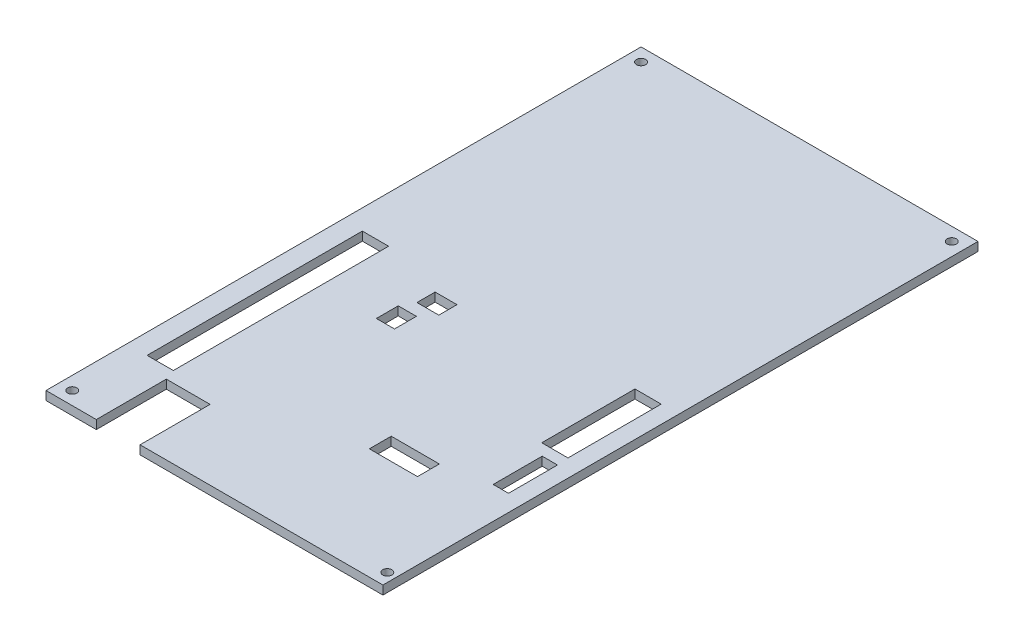
ISO-10303-21;
HEADER;
FILE_DESCRIPTION(('STEP AP214'),'2;1');
FILE_NAME('part.step','',(''),(''),'','','');
FILE_SCHEMA(('AUTOMOTIVE_DESIGN { 1 0 10303 214 1 1 1 1 }'));
ENDSEC;
DATA;
#1=APPLICATION_CONTEXT('core data for automotive mechanical design processes');
#2=APPLICATION_PROTOCOL_DEFINITION('international standard','automotive_design',2000,#1);
#3=PRODUCT_CONTEXT('',#1,'mechanical');
#4=PRODUCT('Part','Part','',(#3));
#5=PRODUCT_RELATED_PRODUCT_CATEGORY('part','',(#4));
#6=PRODUCT_DEFINITION_FORMATION('','',#4);
#7=PRODUCT_DEFINITION_CONTEXT('part definition',#1,'design');
#8=PRODUCT_DEFINITION('design','',#6,#7);
#9=PRODUCT_DEFINITION_SHAPE('','',#8);
#10=(LENGTH_UNIT() NAMED_UNIT(*) SI_UNIT(.MILLI.,.METRE.));
#11=(NAMED_UNIT(*) PLANE_ANGLE_UNIT() SI_UNIT($,.RADIAN.));
#12=(NAMED_UNIT(*) SI_UNIT($,.STERADIAN.) SOLID_ANGLE_UNIT());
#13=UNCERTAINTY_MEASURE_WITH_UNIT(LENGTH_MEASURE(1.E-05),#10,'distance_accuracy_value','');
#14=(GEOMETRIC_REPRESENTATION_CONTEXT(3) GLOBAL_UNCERTAINTY_ASSIGNED_CONTEXT((#13)) GLOBAL_UNIT_ASSIGNED_CONTEXT((#10,
#11,#12)) REPRESENTATION_CONTEXT('',''));
#15=CARTESIAN_POINT('',(0.,0.,0.));
#16=DIRECTION('',(0.,0.,1.));
#17=DIRECTION('',(1.,0.,0.));
#18=AXIS2_PLACEMENT_3D('',#15,#16,#17);
#19=CARTESIAN_POINT('',(0.,2.,72.05));
#20=DIRECTION('',(0.,0.,-1.));
#21=DIRECTION('',(-1.,0.,0.));
#22=AXIS2_PLACEMENT_3D('',#19,#20,#21);
#23=PLANE('',#22);
#24=DIRECTION('',(1.,0.,0.));
#25=VECTOR('',#24,1.);
#26=CARTESIAN_POINT('',(0.,0.,72.05));
#27=LINE('',#26,#25);
#28=CARTESIAN_POINT('',(24.98,0.,72.05));
#29=VERTEX_POINT('',#28);
#30=CARTESIAN_POINT('',(29.98,0.,72.05));
#31=VERTEX_POINT('',#30);
#32=EDGE_CURVE('E564',#29,#31,#27,.T.);
#33=ORIENTED_EDGE('',*,*,#32,.T.);
#34=DIRECTION('',(0.,-1.,0.));
#35=VECTOR('',#34,1.);
#36=CARTESIAN_POINT('',(29.98,2.,72.05));
#37=LINE('',#36,#35);
#38=CARTESIAN_POINT('',(29.98,2.,72.05));
#39=VERTEX_POINT('',#38);
#40=EDGE_CURVE('E12',#39,#31,#37,.T.);
#41=ORIENTED_EDGE('',*,*,#40,.F.);
#42=DIRECTION('',(1.,0.,0.));
#43=VECTOR('',#42,1.);
#44=CARTESIAN_POINT('',(0.,2.,72.05));
#45=LINE('',#44,#43);
#46=CARTESIAN_POINT('',(24.98,2.,72.05));
#47=VERTEX_POINT('',#46);
#48=EDGE_CURVE('E266',#47,#39,#45,.T.);
#49=ORIENTED_EDGE('',*,*,#48,.F.);
#50=DIRECTION('',(0.,-1.,0.));
#51=VECTOR('',#50,1.);
#52=CARTESIAN_POINT('',(24.98,2.,72.05));
#53=LINE('',#52,#51);
#54=EDGE_CURVE('E62',#47,#29,#53,.T.);
#55=ORIENTED_EDGE('',*,*,#54,.T.);
#56=EDGE_LOOP('',(#33,#41,#49,#55));
#57=FACE_BOUND('',#56,.T.);
#58=ADVANCED_FACE('F42',(#57),#23,.F.);
#59=CARTESIAN_POINT('',(29.98,2.,0.));
#60=DIRECTION('',(1.,0.,0.));
#61=DIRECTION('',(0.,0.,-1.));
#62=AXIS2_PLACEMENT_3D('',#59,#60,#61);
#63=PLANE('',#62);
#64=DIRECTION('',(0.,0.,1.));
#65=VECTOR('',#64,1.);
#66=CARTESIAN_POINT('',(29.98,0.,0.));
#67=LINE('',#66,#65);
#68=CARTESIAN_POINT('',(29.98,0.,76.2));
#69=VERTEX_POINT('',#68);
#70=EDGE_CURVE('E273',#31,#69,#67,.T.);
#71=ORIENTED_EDGE('',*,*,#70,.T.);
#72=DIRECTION('',(0.,-1.,0.));
#73=VECTOR('',#72,1.);
#74=CARTESIAN_POINT('',(29.98,2.,76.2));
#75=LINE('',#74,#73);
#76=CARTESIAN_POINT('',(29.98,2.,76.2));
#77=VERTEX_POINT('',#76);
#78=EDGE_CURVE('E53',#77,#69,#75,.T.);
#79=ORIENTED_EDGE('',*,*,#78,.F.);
#80=DIRECTION('',(0.,0.,1.));
#81=VECTOR('',#80,1.);
#82=CARTESIAN_POINT('',(29.98,2.,0.));
#83=LINE('',#82,#81);
#84=EDGE_CURVE('E260',#39,#77,#83,.T.);
#85=ORIENTED_EDGE('',*,*,#84,.F.);
#86=ORIENTED_EDGE('',*,*,#40,.T.);
#87=EDGE_LOOP('',(#71,#79,#85,#86));
#88=FACE_BOUND('',#87,.T.);
#89=ADVANCED_FACE('F272',(#88),#63,.F.);
#90=CARTESIAN_POINT('',(0.,2.,76.2));
#91=DIRECTION('',(0.,0.,-1.));
#92=DIRECTION('',(-1.,0.,0.));
#93=AXIS2_PLACEMENT_3D('',#90,#91,#92);
#94=PLANE('',#93);
#95=DIRECTION('',(1.,0.,0.));
#96=VECTOR('',#95,1.);
#97=CARTESIAN_POINT('',(0.,0.,76.2));
#98=LINE('',#97,#96);
#99=CARTESIAN_POINT('',(24.98,0.,76.2));
#100=VERTEX_POINT('',#99);
#101=EDGE_CURVE('E559',#100,#69,#98,.T.);
#102=ORIENTED_EDGE('',*,*,#101,.F.);
#103=DIRECTION('',(0.,-1.,0.));
#104=VECTOR('',#103,1.);
#105=CARTESIAN_POINT('',(24.98,2.,76.2));
#106=LINE('',#105,#104);
#107=CARTESIAN_POINT('',(24.98,2.,76.2));
#108=VERTEX_POINT('',#107);
#109=EDGE_CURVE('E160',#108,#100,#106,.T.);
#110=ORIENTED_EDGE('',*,*,#109,.F.);
#111=DIRECTION('',(1.,0.,0.));
#112=VECTOR('',#111,1.);
#113=CARTESIAN_POINT('',(0.,2.,76.2));
#114=LINE('',#113,#112);
#115=EDGE_CURVE('E265',#108,#77,#114,.T.);
#116=ORIENTED_EDGE('',*,*,#115,.T.);
#117=ORIENTED_EDGE('',*,*,#78,.T.);
#118=EDGE_LOOP('',(#102,#110,#116,#117));
#119=FACE_BOUND('',#118,.T.);
#120=ADVANCED_FACE('F278',(#119),#94,.T.);
#121=CARTESIAN_POINT('',(0.,2.,79.));
#122=DIRECTION('',(0.,0.,-1.));
#123=DIRECTION('',(-1.,0.,0.));
#124=AXIS2_PLACEMENT_3D('',#121,#122,#123);
#125=PLANE('',#124);
#126=DIRECTION('',(1.,0.,0.));
#127=VECTOR('',#126,1.);
#128=CARTESIAN_POINT('',(0.,0.,79.));
#129=LINE('',#128,#127);
#130=CARTESIAN_POINT('',(23.5,0.,79.));
#131=VERTEX_POINT('',#130);
#132=CARTESIAN_POINT('',(27.65,0.,79.));
#133=VERTEX_POINT('',#132);
#134=EDGE_CURVE('E579',#131,#133,#129,.T.);
#135=ORIENTED_EDGE('',*,*,#134,.T.);
#136=DIRECTION('',(0.,-1.,0.));
#137=VECTOR('',#136,1.);
#138=CARTESIAN_POINT('',(27.65,2.,79.));
#139=LINE('',#138,#137);
#140=CARTESIAN_POINT('',(27.65,2.,79.));
#141=VERTEX_POINT('',#140);
#142=EDGE_CURVE('E538',#141,#133,#139,.T.);
#143=ORIENTED_EDGE('',*,*,#142,.F.);
#144=DIRECTION('',(1.,0.,0.));
#145=VECTOR('',#144,1.);
#146=CARTESIAN_POINT('',(0.,2.,79.));
#147=LINE('',#146,#145);
#148=CARTESIAN_POINT('',(23.5,2.,79.));
#149=VERTEX_POINT('',#148);
#150=EDGE_CURVE('E314',#149,#141,#147,.T.);
#151=ORIENTED_EDGE('',*,*,#150,.F.);
#152=DIRECTION('',(0.,-1.,0.));
#153=VECTOR('',#152,1.);
#154=CARTESIAN_POINT('',(23.5,2.,79.));
#155=LINE('',#154,#153);
#156=EDGE_CURVE('E529',#149,#131,#155,.T.);
#157=ORIENTED_EDGE('',*,*,#156,.T.);
#158=EDGE_LOOP('',(#135,#143,#151,#157));
#159=FACE_BOUND('',#158,.T.);
#160=ADVANCED_FACE('F726',(#159),#125,.F.);
#161=CARTESIAN_POINT('',(27.65,2.,0.));
#162=DIRECTION('',(1.,0.,0.));
#163=DIRECTION('',(0.,0.,-1.));
#164=AXIS2_PLACEMENT_3D('',#161,#162,#163);
#165=PLANE('',#164);
#166=DIRECTION('',(0.,0.,1.));
#167=VECTOR('',#166,1.);
#168=CARTESIAN_POINT('',(27.65,0.,0.));
#169=LINE('',#168,#167);
#170=CARTESIAN_POINT('',(27.65,0.,84.));
#171=VERTEX_POINT('',#170);
#172=EDGE_CURVE('E575',#133,#171,#169,.T.);
#173=ORIENTED_EDGE('',*,*,#172,.T.);
#174=DIRECTION('',(0.,-1.,0.));
#175=VECTOR('',#174,1.);
#176=CARTESIAN_POINT('',(27.65,2.,84.));
#177=LINE('',#176,#175);
#178=CARTESIAN_POINT('',(27.65,2.,84.));
#179=VERTEX_POINT('',#178);
#180=EDGE_CURVE('E542',#179,#171,#177,.T.);
#181=ORIENTED_EDGE('',*,*,#180,.F.);
#182=DIRECTION('',(0.,0.,1.));
#183=VECTOR('',#182,1.);
#184=CARTESIAN_POINT('',(27.65,2.,0.));
#185=LINE('',#184,#183);
#186=EDGE_CURVE('E306',#141,#179,#185,.T.);
#187=ORIENTED_EDGE('',*,*,#186,.F.);
#188=ORIENTED_EDGE('',*,*,#142,.T.);
#189=EDGE_LOOP('',(#173,#181,#187,#188));
#190=FACE_BOUND('',#189,.T.);
#191=ADVANCED_FACE('F722',(#190),#165,.F.);
#192=CARTESIAN_POINT('',(0.,2.,84.));
#193=DIRECTION('',(0.,0.,-1.));
#194=DIRECTION('',(-1.,0.,0.));
#195=AXIS2_PLACEMENT_3D('',#192,#193,#194);
#196=PLANE('',#195);
#197=DIRECTION('',(1.,0.,0.));
#198=VECTOR('',#197,1.);
#199=CARTESIAN_POINT('',(0.,0.,84.));
#200=LINE('',#199,#198);
#201=CARTESIAN_POINT('',(23.5,0.,84.));
#202=VERTEX_POINT('',#201);
#203=EDGE_CURVE('E571',#202,#171,#200,.T.);
#204=ORIENTED_EDGE('',*,*,#203,.F.);
#205=DIRECTION('',(0.,-1.,0.));
#206=VECTOR('',#205,1.);
#207=CARTESIAN_POINT('',(23.5,2.,84.));
#208=LINE('',#207,#206);
#209=CARTESIAN_POINT('',(23.5,2.,84.));
#210=VERTEX_POINT('',#209);
#211=EDGE_CURVE('E545',#210,#202,#208,.T.);
#212=ORIENTED_EDGE('',*,*,#211,.F.);
#213=DIRECTION('',(1.,0.,0.));
#214=VECTOR('',#213,1.);
#215=CARTESIAN_POINT('',(0.,2.,84.));
#216=LINE('',#215,#214);
#217=EDGE_CURVE('E301',#210,#179,#216,.T.);
#218=ORIENTED_EDGE('',*,*,#217,.T.);
#219=ORIENTED_EDGE('',*,*,#180,.T.);
#220=EDGE_LOOP('',(#204,#212,#218,#219));
#221=FACE_BOUND('',#220,.T.);
#222=ADVANCED_FACE('F718',(#221),#196,.T.);
#223=CARTESIAN_POINT('',(0.,2.,105.6));
#224=DIRECTION('',(0.,0.,-1.));
#225=DIRECTION('',(-1.,0.,0.));
#226=AXIS2_PLACEMENT_3D('',#223,#224,#225);
#227=PLANE('',#226);
#228=DIRECTION('',(1.,0.,0.));
#229=VECTOR('',#228,1.);
#230=CARTESIAN_POINT('',(0.,0.,105.6));
#231=LINE('',#230,#229);
#232=CARTESIAN_POINT('',(48.5,0.,105.6));
#233=VERTEX_POINT('',#232);
#234=CARTESIAN_POINT('',(59.5,0.,105.6));
#235=VERTEX_POINT('',#234);
#236=EDGE_CURVE('E595',#233,#235,#231,.T.);
#237=ORIENTED_EDGE('',*,*,#236,.T.);
#238=DIRECTION('',(0.,-1.,0.));
#239=VECTOR('',#238,1.);
#240=CARTESIAN_POINT('',(59.5,2.,105.6));
#241=LINE('',#240,#239);
#242=CARTESIAN_POINT('',(59.5,2.,105.6));
#243=VERTEX_POINT('',#242);
#244=EDGE_CURVE('E525',#243,#235,#241,.T.);
#245=ORIENTED_EDGE('',*,*,#244,.F.);
#246=DIRECTION('',(1.,0.,0.));
#247=VECTOR('',#246,1.);
#248=CARTESIAN_POINT('',(0.,2.,105.6));
#249=LINE('',#248,#247);
#250=CARTESIAN_POINT('',(48.5,2.,105.6));
#251=VERTEX_POINT('',#250);
#252=EDGE_CURVE('E336',#251,#243,#249,.T.);
#253=ORIENTED_EDGE('',*,*,#252,.F.);
#254=DIRECTION('',(0.,-1.,0.));
#255=VECTOR('',#254,1.);
#256=CARTESIAN_POINT('',(48.5,2.,105.6));
#257=LINE('',#256,#255);
#258=EDGE_CURVE('E516',#251,#233,#257,.T.);
#259=ORIENTED_EDGE('',*,*,#258,.T.);
#260=EDGE_LOOP('',(#237,#245,#253,#259));
#261=FACE_BOUND('',#260,.T.);
#262=ADVANCED_FACE('F721',(#261),#227,.F.);
#263=CARTESIAN_POINT('',(59.5,2.,0.));
#264=DIRECTION('',(1.,0.,0.));
#265=DIRECTION('',(0.,0.,-1.));
#266=AXIS2_PLACEMENT_3D('',#263,#264,#265);
#267=PLANE('',#266);
#268=DIRECTION('',(0.,0.,1.));
#269=VECTOR('',#268,1.);
#270=CARTESIAN_POINT('',(59.5,0.,0.));
#271=LINE('',#270,#269);
#272=CARTESIAN_POINT('',(59.5,0.,110.6));
#273=VERTEX_POINT('',#272);
#274=EDGE_CURVE('E591',#235,#273,#271,.T.);
#275=ORIENTED_EDGE('',*,*,#274,.T.);
#276=DIRECTION('',(0.,-1.,0.));
#277=VECTOR('',#276,1.);
#278=CARTESIAN_POINT('',(59.5,2.,110.6));
#279=LINE('',#278,#277);
#280=CARTESIAN_POINT('',(59.5,2.,110.6));
#281=VERTEX_POINT('',#280);
#282=EDGE_CURVE('E530',#281,#273,#279,.T.);
#283=ORIENTED_EDGE('',*,*,#282,.F.);
#284=DIRECTION('',(0.,0.,1.));
#285=VECTOR('',#284,1.);
#286=CARTESIAN_POINT('',(59.5,2.,0.));
#287=LINE('',#286,#285);
#288=EDGE_CURVE('E328',#243,#281,#287,.T.);
#289=ORIENTED_EDGE('',*,*,#288,.F.);
#290=ORIENTED_EDGE('',*,*,#244,.T.);
#291=EDGE_LOOP('',(#275,#283,#289,#290));
#292=FACE_BOUND('',#291,.T.);
#293=ADVANCED_FACE('F739',(#292),#267,.F.);
#294=CARTESIAN_POINT('',(0.,2.,110.6));
#295=DIRECTION('',(0.,0.,-1.));
#296=DIRECTION('',(-1.,0.,0.));
#297=AXIS2_PLACEMENT_3D('',#294,#295,#296);
#298=PLANE('',#297);
#299=DIRECTION('',(1.,0.,0.));
#300=VECTOR('',#299,1.);
#301=CARTESIAN_POINT('',(0.,0.,110.6));
#302=LINE('',#301,#300);
#303=CARTESIAN_POINT('',(48.5,0.,110.6));
#304=VERTEX_POINT('',#303);
#305=EDGE_CURVE('E587',#304,#273,#302,.T.);
#306=ORIENTED_EDGE('',*,*,#305,.F.);
#307=DIRECTION('',(0.,-1.,0.));
#308=VECTOR('',#307,1.);
#309=CARTESIAN_POINT('',(48.5,2.,110.6));
#310=LINE('',#309,#308);
#311=CARTESIAN_POINT('',(48.5,2.,110.6));
#312=VERTEX_POINT('',#311);
#313=EDGE_CURVE('E533',#312,#304,#310,.T.);
#314=ORIENTED_EDGE('',*,*,#313,.F.);
#315=DIRECTION('',(1.,0.,0.));
#316=VECTOR('',#315,1.);
#317=CARTESIAN_POINT('',(0.,2.,110.6));
#318=LINE('',#317,#316);
#319=EDGE_CURVE('E323',#312,#281,#318,.T.);
#320=ORIENTED_EDGE('',*,*,#319,.T.);
#321=ORIENTED_EDGE('',*,*,#282,.T.);
#322=EDGE_LOOP('',(#306,#314,#320,#321));
#323=FACE_BOUND('',#322,.T.);
#324=ADVANCED_FACE('F735',(#323),#298,.T.);
#325=CARTESIAN_POINT('',(0.,2.,92.3));
#326=DIRECTION('',(0.,0.,-1.));
#327=DIRECTION('',(-1.,0.,0.));
#328=AXIS2_PLACEMENT_3D('',#325,#326,#327);
#329=PLANE('',#328);
#330=DIRECTION('',(1.,0.,0.));
#331=VECTOR('',#330,1.);
#332=CARTESIAN_POINT('',(0.,0.,92.3));
#333=LINE('',#332,#331);
#334=CARTESIAN_POINT('',(69.7,0.,92.3));
#335=VERTEX_POINT('',#334);
#336=CARTESIAN_POINT('',(73.2,0.,92.3));
#337=VERTEX_POINT('',#336);
#338=EDGE_CURVE('E611',#335,#337,#333,.T.);
#339=ORIENTED_EDGE('',*,*,#338,.T.);
#340=DIRECTION('',(0.,-1.,0.));
#341=VECTOR('',#340,1.);
#342=CARTESIAN_POINT('',(73.2,2.,92.3));
#343=LINE('',#342,#341);
#344=CARTESIAN_POINT('',(73.2,2.,92.3));
#345=VERTEX_POINT('',#344);
#346=EDGE_CURVE('E512',#345,#337,#343,.T.);
#347=ORIENTED_EDGE('',*,*,#346,.F.);
#348=DIRECTION('',(1.,0.,0.));
#349=VECTOR('',#348,1.);
#350=CARTESIAN_POINT('',(0.,2.,92.3));
#351=LINE('',#350,#349);
#352=CARTESIAN_POINT('',(69.7,2.,92.3));
#353=VERTEX_POINT('',#352);
#354=EDGE_CURVE('E358',#353,#345,#351,.T.);
#355=ORIENTED_EDGE('',*,*,#354,.F.);
#356=DIRECTION('',(0.,-1.,0.));
#357=VECTOR('',#356,1.);
#358=CARTESIAN_POINT('',(69.7,2.,92.3));
#359=LINE('',#358,#357);
#360=EDGE_CURVE('E503',#353,#335,#359,.T.);
#361=ORIENTED_EDGE('',*,*,#360,.T.);
#362=EDGE_LOOP('',(#339,#347,#355,#361));
#363=FACE_BOUND('',#362,.T.);
#364=ADVANCED_FACE('F738',(#363),#329,.F.);
#365=CARTESIAN_POINT('',(73.2,2.,0.));
#366=DIRECTION('',(1.,0.,0.));
#367=DIRECTION('',(0.,0.,-1.));
#368=AXIS2_PLACEMENT_3D('',#365,#366,#367);
#369=PLANE('',#368);
#370=DIRECTION('',(0.,0.,1.));
#371=VECTOR('',#370,1.);
#372=CARTESIAN_POINT('',(73.2,0.,0.));
#373=LINE('',#372,#371);
#374=CARTESIAN_POINT('',(73.2,0.,103.5));
#375=VERTEX_POINT('',#374);
#376=EDGE_CURVE('E607',#337,#375,#373,.T.);
#377=ORIENTED_EDGE('',*,*,#376,.T.);
#378=DIRECTION('',(0.,-1.,0.));
#379=VECTOR('',#378,1.);
#380=CARTESIAN_POINT('',(73.2,2.,103.5));
#381=LINE('',#380,#379);
#382=CARTESIAN_POINT('',(73.2,2.,103.5));
#383=VERTEX_POINT('',#382);
#384=EDGE_CURVE('E517',#383,#375,#381,.T.);
#385=ORIENTED_EDGE('',*,*,#384,.F.);
#386=DIRECTION('',(0.,0.,1.));
#387=VECTOR('',#386,1.);
#388=CARTESIAN_POINT('',(73.2,2.,0.));
#389=LINE('',#388,#387);
#390=EDGE_CURVE('E350',#345,#383,#389,.T.);
#391=ORIENTED_EDGE('',*,*,#390,.F.);
#392=ORIENTED_EDGE('',*,*,#346,.T.);
#393=EDGE_LOOP('',(#377,#385,#391,#392));
#394=FACE_BOUND('',#393,.T.);
#395=ADVANCED_FACE('F755',(#394),#369,.F.);
#396=CARTESIAN_POINT('',(0.,2.,103.5));
#397=DIRECTION('',(0.,0.,-1.));
#398=DIRECTION('',(-1.,0.,0.));
#399=AXIS2_PLACEMENT_3D('',#396,#397,#398);
#400=PLANE('',#399);
#401=DIRECTION('',(1.,0.,0.));
#402=VECTOR('',#401,1.);
#403=CARTESIAN_POINT('',(0.,0.,103.5));
#404=LINE('',#403,#402);
#405=CARTESIAN_POINT('',(69.7,0.,103.5));
#406=VERTEX_POINT('',#405);
#407=EDGE_CURVE('E603',#406,#375,#404,.T.);
#408=ORIENTED_EDGE('',*,*,#407,.F.);
#409=DIRECTION('',(0.,-1.,0.));
#410=VECTOR('',#409,1.);
#411=CARTESIAN_POINT('',(69.7,2.,103.5));
#412=LINE('',#411,#410);
#413=CARTESIAN_POINT('',(69.7,2.,103.5));
#414=VERTEX_POINT('',#413);
#415=EDGE_CURVE('E520',#414,#406,#412,.T.);
#416=ORIENTED_EDGE('',*,*,#415,.F.);
#417=DIRECTION('',(1.,0.,0.));
#418=VECTOR('',#417,1.);
#419=CARTESIAN_POINT('',(0.,2.,103.5));
#420=LINE('',#419,#418);
#421=EDGE_CURVE('E345',#414,#383,#420,.T.);
#422=ORIENTED_EDGE('',*,*,#421,.T.);
#423=ORIENTED_EDGE('',*,*,#384,.T.);
#424=EDGE_LOOP('',(#408,#416,#422,#423));
#425=FACE_BOUND('',#424,.T.);
#426=ADVANCED_FACE('F751',(#425),#400,.T.);
#427=CARTESIAN_POINT('',(0.,2.,68.3));
#428=DIRECTION('',(0.,0.,-1.));
#429=DIRECTION('',(-1.,0.,0.));
#430=AXIS2_PLACEMENT_3D('',#427,#428,#429);
#431=PLANE('',#430);
#432=DIRECTION('',(1.,0.,0.));
#433=VECTOR('',#432,1.);
#434=CARTESIAN_POINT('',(0.,0.,68.3));
#435=LINE('',#434,#433);
#436=CARTESIAN_POINT('',(4.60000000000001,0.,68.3));
#437=VERTEX_POINT('',#436);
#438=CARTESIAN_POINT('',(10.6,0.,68.3));
#439=VERTEX_POINT('',#438);
#440=EDGE_CURVE('E627',#437,#439,#435,.T.);
#441=ORIENTED_EDGE('',*,*,#440,.T.);
#442=DIRECTION('',(0.,-1.,0.));
#443=VECTOR('',#442,1.);
#444=CARTESIAN_POINT('',(10.6,2.,68.3));
#445=LINE('',#444,#443);
#446=CARTESIAN_POINT('',(10.6,2.,68.3));
#447=VERTEX_POINT('',#446);
#448=EDGE_CURVE('E499',#447,#439,#445,.T.);
#449=ORIENTED_EDGE('',*,*,#448,.F.);
#450=DIRECTION('',(1.,0.,0.));
#451=VECTOR('',#450,1.);
#452=CARTESIAN_POINT('',(0.,2.,68.3));
#453=LINE('',#452,#451);
#454=CARTESIAN_POINT('',(4.60000000000001,2.,68.3));
#455=VERTEX_POINT('',#454);
#456=EDGE_CURVE('E380',#455,#447,#453,.T.);
#457=ORIENTED_EDGE('',*,*,#456,.F.);
#458=DIRECTION('',(0.,-1.,0.));
#459=VECTOR('',#458,1.);
#460=CARTESIAN_POINT('',(4.60000000000001,2.,68.3));
#461=LINE('',#460,#459);
#462=EDGE_CURVE('E489',#455,#437,#461,.T.);
#463=ORIENTED_EDGE('',*,*,#462,.T.);
#464=EDGE_LOOP('',(#441,#449,#457,#463));
#465=FACE_BOUND('',#464,.T.);
#466=ADVANCED_FACE('F754',(#465),#431,.F.);
#467=CARTESIAN_POINT('',(10.6,2.,0.));
#468=DIRECTION('',(1.,0.,0.));
#469=DIRECTION('',(0.,0.,-1.));
#470=AXIS2_PLACEMENT_3D('',#467,#468,#469);
#471=PLANE('',#470);
#472=DIRECTION('',(0.,0.,1.));
#473=VECTOR('',#472,1.);
#474=CARTESIAN_POINT('',(10.6,0.,0.));
#475=LINE('',#474,#473);
#476=CARTESIAN_POINT('',(10.6,0.,117.5));
#477=VERTEX_POINT('',#476);
#478=EDGE_CURVE('E623',#439,#477,#475,.T.);
#479=ORIENTED_EDGE('',*,*,#478,.T.);
#480=DIRECTION('',(0.,-1.,0.));
#481=VECTOR('',#480,1.);
#482=CARTESIAN_POINT('',(10.6,2.,117.5));
#483=LINE('',#482,#481);
#484=CARTESIAN_POINT('',(10.6,2.,117.5));
#485=VERTEX_POINT('',#484);
#486=EDGE_CURVE('E504',#485,#477,#483,.T.);
#487=ORIENTED_EDGE('',*,*,#486,.F.);
#488=DIRECTION('',(0.,0.,1.));
#489=VECTOR('',#488,1.);
#490=CARTESIAN_POINT('',(10.6,2.,0.));
#491=LINE('',#490,#489);
#492=EDGE_CURVE('E372',#447,#485,#491,.T.);
#493=ORIENTED_EDGE('',*,*,#492,.F.);
#494=ORIENTED_EDGE('',*,*,#448,.T.);
#495=EDGE_LOOP('',(#479,#487,#493,#494));
#496=FACE_BOUND('',#495,.T.);
#497=ADVANCED_FACE('F771',(#496),#471,.F.);
#498=CARTESIAN_POINT('',(0.,2.,117.5));
#499=DIRECTION('',(0.,0.,-1.));
#500=DIRECTION('',(-1.,0.,0.));
#501=AXIS2_PLACEMENT_3D('',#498,#499,#500);
#502=PLANE('',#501);
#503=DIRECTION('',(1.,0.,0.));
#504=VECTOR('',#503,1.);
#505=CARTESIAN_POINT('',(0.,0.,117.5));
#506=LINE('',#505,#504);
#507=CARTESIAN_POINT('',(4.60000000000001,0.,117.5));
#508=VERTEX_POINT('',#507);
#509=EDGE_CURVE('E619',#508,#477,#506,.T.);
#510=ORIENTED_EDGE('',*,*,#509,.F.);
#511=DIRECTION('',(0.,-1.,0.));
#512=VECTOR('',#511,1.);
#513=CARTESIAN_POINT('',(4.60000000000001,2.,117.5));
#514=LINE('',#513,#512);
#515=CARTESIAN_POINT('',(4.60000000000001,2.,117.5));
#516=VERTEX_POINT('',#515);
#517=EDGE_CURVE('E507',#516,#508,#514,.T.);
#518=ORIENTED_EDGE('',*,*,#517,.F.);
#519=DIRECTION('',(1.,0.,0.));
#520=VECTOR('',#519,1.);
#521=CARTESIAN_POINT('',(0.,2.,117.5));
#522=LINE('',#521,#520);
#523=EDGE_CURVE('E367',#516,#485,#522,.T.);
#524=ORIENTED_EDGE('',*,*,#523,.T.);
#525=ORIENTED_EDGE('',*,*,#486,.T.);
#526=EDGE_LOOP('',(#510,#518,#524,#525));
#527=FACE_BOUND('',#526,.T.);
#528=ADVANCED_FACE('F767',(#527),#502,.T.);
#529=CARTESIAN_POINT('',(67.,2.,0.));
#530=DIRECTION('',(1.,0.,0.));
#531=DIRECTION('',(0.,0.,-1.));
#532=AXIS2_PLACEMENT_3D('',#529,#530,#531);
#533=PLANE('',#532);
#534=DIRECTION('',(0.,0.,1.));
#535=VECTOR('',#534,1.);
#536=CARTESIAN_POINT('',(67.,0.,0.));
#537=LINE('',#536,#535);
#538=CARTESIAN_POINT('',(67.,0.,68.4));
#539=VERTEX_POINT('',#538);
#540=CARTESIAN_POINT('',(67.,0.,89.7));
#541=VERTEX_POINT('',#540);
#542=EDGE_CURVE('E643',#539,#541,#537,.T.);
#543=ORIENTED_EDGE('',*,*,#542,.F.);
#544=DIRECTION('',(0.,-1.,0.));
#545=VECTOR('',#544,1.);
#546=CARTESIAN_POINT('',(67.,2.,68.4));
#547=LINE('',#546,#545);
#548=CARTESIAN_POINT('',(67.,2.,68.4));
#549=VERTEX_POINT('',#548);
#550=EDGE_CURVE('E486',#549,#539,#547,.T.);
#551=ORIENTED_EDGE('',*,*,#550,.F.);
#552=DIRECTION('',(0.,0.,1.));
#553=VECTOR('',#552,1.);
#554=CARTESIAN_POINT('',(67.,2.,0.));
#555=LINE('',#554,#553);
#556=CARTESIAN_POINT('',(67.,2.,89.7));
#557=VERTEX_POINT('',#556);
#558=EDGE_CURVE('E401',#549,#557,#555,.T.);
#559=ORIENTED_EDGE('',*,*,#558,.T.);
#560=DIRECTION('',(0.,-1.,0.));
#561=VECTOR('',#560,1.);
#562=CARTESIAN_POINT('',(67.,2.,89.7));
#563=LINE('',#562,#561);
#564=EDGE_CURVE('E466',#557,#541,#563,.T.);
#565=ORIENTED_EDGE('',*,*,#564,.T.);
#566=EDGE_LOOP('',(#543,#551,#559,#565));
#567=FACE_BOUND('',#566,.T.);
#568=ADVANCED_FACE('F770',(#567),#533,.T.);
#569=CARTESIAN_POINT('',(1.58206781009085E-13,2.,68.4000000000002));
#570=DIRECTION('',(0.,0.,1.));
#571=DIRECTION('',(1.,0.,0.));
#572=AXIS2_PLACEMENT_3D('',#569,#570,#571);
#573=PLANE('',#572);
#574=DIRECTION('',(-1.,0.,0.));
#575=VECTOR('',#574,1.);
#576=CARTESIAN_POINT('',(1.58206781009085E-13,0.,68.4000000000002));
#577=LINE('',#576,#575);
#578=CARTESIAN_POINT('',(73.,0.,68.4));
#579=VERTEX_POINT('',#578);
#580=EDGE_CURVE('E639',#579,#539,#577,.T.);
#581=ORIENTED_EDGE('',*,*,#580,.F.);
#582=DIRECTION('',(0.,-1.,0.));
#583=VECTOR('',#582,1.);
#584=CARTESIAN_POINT('',(73.,2.,68.4));
#585=LINE('',#584,#583);
#586=CARTESIAN_POINT('',(73.,2.,68.4));
#587=VERTEX_POINT('',#586);
#588=EDGE_CURVE('E490',#587,#579,#585,.T.);
#589=ORIENTED_EDGE('',*,*,#588,.F.);
#590=DIRECTION('',(-1.,0.,0.));
#591=VECTOR('',#590,1.);
#592=CARTESIAN_POINT('',(1.58206781009085E-13,2.,68.4000000000002));
#593=LINE('',#592,#591);
#594=EDGE_CURVE('E393',#587,#549,#593,.T.);
#595=ORIENTED_EDGE('',*,*,#594,.T.);
#596=ORIENTED_EDGE('',*,*,#550,.T.);
#597=EDGE_LOOP('',(#581,#589,#595,#596));
#598=FACE_BOUND('',#597,.T.);
#599=ADVANCED_FACE('F787',(#598),#573,.T.);
#600=CARTESIAN_POINT('',(73.,2.,0.));
#601=DIRECTION('',(1.,0.,0.));
#602=DIRECTION('',(0.,0.,-1.));
#603=AXIS2_PLACEMENT_3D('',#600,#601,#602);
#604=PLANE('',#603);
#605=DIRECTION('',(0.,0.,1.));
#606=VECTOR('',#605,1.);
#607=CARTESIAN_POINT('',(73.,0.,0.));
#608=LINE('',#607,#606);
#609=CARTESIAN_POINT('',(73.,0.,89.7));
#610=VERTEX_POINT('',#609);
#611=EDGE_CURVE('E635',#579,#610,#608,.T.);
#612=ORIENTED_EDGE('',*,*,#611,.T.);
#613=DIRECTION('',(0.,-1.,0.));
#614=VECTOR('',#613,1.);
#615=CARTESIAN_POINT('',(73.,2.,89.7));
#616=LINE('',#615,#614);
#617=CARTESIAN_POINT('',(73.,2.,89.7));
#618=VERTEX_POINT('',#617);
#619=EDGE_CURVE('E493',#618,#610,#616,.T.);
#620=ORIENTED_EDGE('',*,*,#619,.F.);
#621=DIRECTION('',(0.,0.,1.));
#622=VECTOR('',#621,1.);
#623=CARTESIAN_POINT('',(73.,2.,0.));
#624=LINE('',#623,#622);
#625=EDGE_CURVE('E388',#587,#618,#624,.T.);
#626=ORIENTED_EDGE('',*,*,#625,.F.);
#627=ORIENTED_EDGE('',*,*,#588,.T.);
#628=EDGE_LOOP('',(#612,#620,#626,#627));
#629=FACE_BOUND('',#628,.T.);
#630=ADVANCED_FACE('F783',(#629),#604,.F.);
#631=CARTESIAN_POINT('',(21.5,2.,0.));
#632=DIRECTION('',(-1.,0.,0.));
#633=DIRECTION('',(0.,0.,1.));
#634=AXIS2_PLACEMENT_3D('',#631,#632,#633);
#635=PLANE('',#634);
#636=DIRECTION('',(0.,0.,-1.));
#637=VECTOR('',#636,1.);
#638=CARTESIAN_POINT('',(21.5,0.,0.));
#639=LINE('',#638,#637);
#640=CARTESIAN_POINT('',(21.5,0.,136.));
#641=VERTEX_POINT('',#640);
#642=CARTESIAN_POINT('',(21.5,0.,120.));
#643=VERTEX_POINT('',#642);
#644=EDGE_CURVE('E669',#641,#643,#639,.T.);
#645=ORIENTED_EDGE('',*,*,#644,.F.);
#646=DIRECTION('',(0.,-1.,0.));
#647=VECTOR('',#646,1.);
#648=CARTESIAN_POINT('',(21.5,2.,136.));
#649=LINE('',#648,#647);
#650=CARTESIAN_POINT('',(21.5,2.,136.));
#651=VERTEX_POINT('',#650);
#652=EDGE_CURVE('E46',#651,#641,#649,.T.);
#653=ORIENTED_EDGE('',*,*,#652,.F.);
#654=DIRECTION('',(0.,0.,-1.));
#655=VECTOR('',#654,1.);
#656=CARTESIAN_POINT('',(21.5,2.,0.));
#657=LINE('',#656,#655);
#658=CARTESIAN_POINT('',(21.5,2.,120.));
#659=VERTEX_POINT('',#658);
#660=EDGE_CURVE('E428',#651,#659,#657,.T.);
#661=ORIENTED_EDGE('',*,*,#660,.T.);
#662=DIRECTION('',(0.,-1.,0.));
#663=VECTOR('',#662,1.);
#664=CARTESIAN_POINT('',(21.5,2.,120.));
#665=LINE('',#664,#663);
#666=EDGE_CURVE('E283',#659,#643,#665,.T.);
#667=ORIENTED_EDGE('',*,*,#666,.T.);
#668=EDGE_LOOP('',(#645,#653,#661,#667));
#669=FACE_BOUND('',#668,.T.);
#670=ADVANCED_FACE('F786',(#669),#635,.T.);
#671=CARTESIAN_POINT('',(0.,2.,136.));
#672=DIRECTION('',(0.,0.,-1.));
#673=DIRECTION('',(-1.,0.,0.));
#674=AXIS2_PLACEMENT_3D('',#671,#672,#673);
#675=PLANE('',#674);
#676=DIRECTION('',(1.,0.,0.));
#677=VECTOR('',#676,1.);
#678=CARTESIAN_POINT('',(0.,0.,136.));
#679=LINE('',#678,#677);
#680=CARTESIAN_POINT('',(77.,0.,136.));
#681=VERTEX_POINT('',#680);
#682=EDGE_CURVE('E461',#641,#681,#679,.T.);
#683=ORIENTED_EDGE('',*,*,#682,.T.);
#684=DIRECTION('',(0.,-1.,0.));
#685=VECTOR('',#684,1.);
#686=CARTESIAN_POINT('',(77.,2.,136.));
#687=LINE('',#686,#685);
#688=CARTESIAN_POINT('',(77.,2.,136.));
#689=VERTEX_POINT('',#688);
#690=EDGE_CURVE('E452',#689,#681,#687,.T.);
#691=ORIENTED_EDGE('',*,*,#690,.F.);
#692=DIRECTION('',(1.,0.,0.));
#693=VECTOR('',#692,1.);
#694=CARTESIAN_POINT('',(0.,2.,136.));
#695=LINE('',#694,#693);
#696=EDGE_CURVE('E422',#651,#689,#695,.T.);
#697=ORIENTED_EDGE('',*,*,#696,.F.);
#698=ORIENTED_EDGE('',*,*,#652,.T.);
#699=EDGE_LOOP('',(#683,#691,#697,#698));
#700=FACE_BOUND('',#699,.T.);
#701=ADVANCED_FACE('F459',(#700),#675,.F.);
#702=CARTESIAN_POINT('',(77.,2.,0.));
#703=DIRECTION('',(1.,0.,0.));
#704=DIRECTION('',(0.,0.,-1.));
#705=AXIS2_PLACEMENT_3D('',#702,#703,#704);
#706=PLANE('',#705);
#707=DIRECTION('',(0.,0.,1.));
#708=VECTOR('',#707,1.);
#709=CARTESIAN_POINT('',(77.,0.,0.));
#710=LINE('',#709,#708);
#711=CARTESIAN_POINT('',(77.,0.,0.));
#712=VERTEX_POINT('',#711);
#713=EDGE_CURVE('E664',#712,#681,#710,.T.);
#714=ORIENTED_EDGE('',*,*,#713,.F.);
#715=DIRECTION('',(0.,-1.,0.));
#716=VECTOR('',#715,1.);
#717=CARTESIAN_POINT('',(77.,2.,0.));
#718=LINE('',#717,#716);
#719=CARTESIAN_POINT('',(77.,2.,0.));
#720=VERTEX_POINT('',#719);
#721=EDGE_CURVE('E454',#720,#712,#718,.T.);
#722=ORIENTED_EDGE('',*,*,#721,.F.);
#723=DIRECTION('',(0.,0.,1.));
#724=VECTOR('',#723,1.);
#725=CARTESIAN_POINT('',(77.,2.,0.));
#726=LINE('',#725,#724);
#727=EDGE_CURVE('E427',#720,#689,#726,.T.);
#728=ORIENTED_EDGE('',*,*,#727,.T.);
#729=ORIENTED_EDGE('',*,*,#690,.T.);
#730=EDGE_LOOP('',(#714,#722,#728,#729));
#731=FACE_BOUND('',#730,.T.);
#732=ADVANCED_FACE('F450',(#731),#706,.T.);
#733=CARTESIAN_POINT('',(0.,2.,0.));
#734=DIRECTION('',(0.,0.,-1.));
#735=DIRECTION('',(-1.,0.,0.));
#736=AXIS2_PLACEMENT_3D('',#733,#734,#735);
#737=PLANE('',#736);
#738=DIRECTION('',(1.,0.,0.));
#739=VECTOR('',#738,1.);
#740=CARTESIAN_POINT('',(0.,0.,0.));
#741=LINE('',#740,#739);
#742=CARTESIAN_POINT('',(0.,0.,0.));
#743=VERTEX_POINT('',#742);
#744=EDGE_CURVE('E660',#743,#712,#741,.T.);
#745=ORIENTED_EDGE('',*,*,#744,.F.);
#746=DIRECTION('',(0.,-1.,0.));
#747=VECTOR('',#746,1.);
#748=CARTESIAN_POINT('',(0.,2.,0.));
#749=LINE('',#748,#747);
#750=CARTESIAN_POINT('',(0.,2.,0.));
#751=VERTEX_POINT('',#750);
#752=EDGE_CURVE('E467',#751,#743,#749,.T.);
#753=ORIENTED_EDGE('',*,*,#752,.F.);
#754=DIRECTION('',(1.,0.,0.));
#755=VECTOR('',#754,1.);
#756=CARTESIAN_POINT('',(0.,2.,0.));
#757=LINE('',#756,#755);
#758=EDGE_CURVE('E437',#751,#720,#757,.T.);
#759=ORIENTED_EDGE('',*,*,#758,.T.);
#760=ORIENTED_EDGE('',*,*,#721,.T.);
#761=EDGE_LOOP('',(#745,#753,#759,#760));
#762=FACE_BOUND('',#761,.T.);
#763=ADVANCED_FACE('F809',(#762),#737,.T.);
#764=CARTESIAN_POINT('',(0.,2.,0.));
#765=DIRECTION('',(1.,0.,0.));
#766=DIRECTION('',(0.,0.,-1.));
#767=AXIS2_PLACEMENT_3D('',#764,#765,#766);
#768=PLANE('',#767);
#769=DIRECTION('',(0.,0.,1.));
#770=VECTOR('',#769,1.);
#771=CARTESIAN_POINT('',(0.,0.,0.));
#772=LINE('',#771,#770);
#773=CARTESIAN_POINT('',(0.,0.,136.));
#774=VERTEX_POINT('',#773);
#775=EDGE_CURVE('E656',#743,#774,#772,.T.);
#776=ORIENTED_EDGE('',*,*,#775,.T.);
#777=DIRECTION('',(0.,-1.,0.));
#778=VECTOR('',#777,1.);
#779=CARTESIAN_POINT('',(0.,2.,136.));
#780=LINE('',#779,#778);
#781=CARTESIAN_POINT('',(0.,2.,136.));
#782=VERTEX_POINT('',#781);
#783=EDGE_CURVE('E472',#782,#774,#780,.T.);
#784=ORIENTED_EDGE('',*,*,#783,.F.);
#785=DIRECTION('',(0.,0.,1.));
#786=VECTOR('',#785,1.);
#787=CARTESIAN_POINT('',(0.,2.,0.));
#788=LINE('',#787,#786);
#789=EDGE_CURVE('E415',#751,#782,#788,.T.);
#790=ORIENTED_EDGE('',*,*,#789,.F.);
#791=ORIENTED_EDGE('',*,*,#752,.T.);
#792=EDGE_LOOP('',(#776,#784,#790,#791));
#793=FACE_BOUND('',#792,.T.);
#794=ADVANCED_FACE('F805',(#793),#768,.F.);
#795=CARTESIAN_POINT('',(11.5,0.,136.));
#796=VERTEX_POINT('',#795);
#797=EDGE_CURVE('E655',#774,#796,#679,.T.);
#798=ORIENTED_EDGE('',*,*,#797,.T.);
#799=DIRECTION('',(0.,-1.,0.));
#800=VECTOR('',#799,1.);
#801=CARTESIAN_POINT('',(11.5,2.,136.));
#802=LINE('',#801,#800);
#803=CARTESIAN_POINT('',(11.5,2.,136.));
#804=VERTEX_POINT('',#803);
#805=EDGE_CURVE('E476',#804,#796,#802,.T.);
#806=ORIENTED_EDGE('',*,*,#805,.F.);
#807=EDGE_CURVE('E414',#782,#804,#695,.T.);
#808=ORIENTED_EDGE('',*,*,#807,.F.);
#809=ORIENTED_EDGE('',*,*,#783,.T.);
#810=EDGE_LOOP('',(#798,#806,#808,#809));
#811=FACE_BOUND('',#810,.T.);
#812=ADVANCED_FACE('F801',(#811),#675,.F.);
#813=CARTESIAN_POINT('',(11.5,2.,0.));
#814=DIRECTION('',(-1.,0.,0.));
#815=DIRECTION('',(0.,0.,1.));
#816=AXIS2_PLACEMENT_3D('',#813,#814,#815);
#817=PLANE('',#816);
#818=DIRECTION('',(0.,0.,-1.));
#819=VECTOR('',#818,1.);
#820=CARTESIAN_POINT('',(11.5,0.,0.));
#821=LINE('',#820,#819);
#822=CARTESIAN_POINT('',(11.5,0.,120.));
#823=VERTEX_POINT('',#822);
#824=EDGE_CURVE('E651',#796,#823,#821,.T.);
#825=ORIENTED_EDGE('',*,*,#824,.T.);
#826=DIRECTION('',(0.,-1.,0.));
#827=VECTOR('',#826,1.);
#828=CARTESIAN_POINT('',(11.5,2.,120.));
#829=LINE('',#828,#827);
#830=CARTESIAN_POINT('',(11.5,2.,120.));
#831=VERTEX_POINT('',#830);
#832=EDGE_CURVE('E480',#831,#823,#829,.T.);
#833=ORIENTED_EDGE('',*,*,#832,.F.);
#834=DIRECTION('',(0.,0.,-1.));
#835=VECTOR('',#834,1.);
#836=CARTESIAN_POINT('',(11.5,2.,0.));
#837=LINE('',#836,#835);
#838=EDGE_CURVE('E409',#804,#831,#837,.T.);
#839=ORIENTED_EDGE('',*,*,#838,.F.);
#840=ORIENTED_EDGE('',*,*,#805,.T.);
#841=EDGE_LOOP('',(#825,#833,#839,#840));
#842=FACE_BOUND('',#841,.T.);
#843=ADVANCED_FACE('F716',(#842),#817,.F.);
#844=CARTESIAN_POINT('',(23.5,2.,0.));
#845=DIRECTION('',(1.,0.,0.));
#846=DIRECTION('',(0.,0.,-1.));
#847=AXIS2_PLACEMENT_3D('',#844,#845,#846);
#848=PLANE('',#847);
#849=DIRECTION('',(0.,0.,1.));
#850=VECTOR('',#849,1.);
#851=CARTESIAN_POINT('',(23.5,0.,0.));
#852=LINE('',#851,#850);
#853=EDGE_CURVE('E567',#131,#202,#852,.T.);
#854=ORIENTED_EDGE('',*,*,#853,.F.);
#855=ORIENTED_EDGE('',*,*,#156,.F.);
#856=DIRECTION('',(0.,0.,1.));
#857=VECTOR('',#856,1.);
#858=CARTESIAN_POINT('',(23.5,2.,0.));
#859=LINE('',#858,#857);
#860=EDGE_CURVE('E296',#149,#210,#859,.T.);
#861=ORIENTED_EDGE('',*,*,#860,.T.);
#862=ORIENTED_EDGE('',*,*,#211,.T.);
#863=EDGE_LOOP('',(#854,#855,#861,#862));
#864=FACE_BOUND('',#863,.T.);
#865=ADVANCED_FACE('F712',(#864),#848,.T.);
#866=CARTESIAN_POINT('',(48.5,2.,0.));
#867=DIRECTION('',(1.,0.,0.));
#868=DIRECTION('',(0.,0.,-1.));
#869=AXIS2_PLACEMENT_3D('',#866,#867,#868);
#870=PLANE('',#869);
#871=DIRECTION('',(0.,0.,1.));
#872=VECTOR('',#871,1.);
#873=CARTESIAN_POINT('',(48.5,0.,0.));
#874=LINE('',#873,#872);
#875=EDGE_CURVE('E583',#233,#304,#874,.T.);
#876=ORIENTED_EDGE('',*,*,#875,.F.);
#877=ORIENTED_EDGE('',*,*,#258,.F.);
#878=DIRECTION('',(0.,0.,1.));
#879=VECTOR('',#878,1.);
#880=CARTESIAN_POINT('',(48.5,2.,0.));
#881=LINE('',#880,#879);
#882=EDGE_CURVE('E318',#251,#312,#881,.T.);
#883=ORIENTED_EDGE('',*,*,#882,.T.);
#884=ORIENTED_EDGE('',*,*,#313,.T.);
#885=EDGE_LOOP('',(#876,#877,#883,#884));
#886=FACE_BOUND('',#885,.T.);
#887=ADVANCED_FACE('F715',(#886),#870,.T.);
#888=CARTESIAN_POINT('',(69.7,2.,0.));
#889=DIRECTION('',(1.,0.,0.));
#890=DIRECTION('',(0.,0.,-1.));
#891=AXIS2_PLACEMENT_3D('',#888,#889,#890);
#892=PLANE('',#891);
#893=DIRECTION('',(0.,0.,1.));
#894=VECTOR('',#893,1.);
#895=CARTESIAN_POINT('',(69.7,0.,0.));
#896=LINE('',#895,#894);
#897=EDGE_CURVE('E599',#335,#406,#896,.T.);
#898=ORIENTED_EDGE('',*,*,#897,.F.);
#899=ORIENTED_EDGE('',*,*,#360,.F.);
#900=DIRECTION('',(0.,0.,1.));
#901=VECTOR('',#900,1.);
#902=CARTESIAN_POINT('',(69.7,2.,0.));
#903=LINE('',#902,#901);
#904=EDGE_CURVE('E340',#353,#414,#903,.T.);
#905=ORIENTED_EDGE('',*,*,#904,.T.);
#906=ORIENTED_EDGE('',*,*,#415,.T.);
#907=EDGE_LOOP('',(#898,#899,#905,#906));
#908=FACE_BOUND('',#907,.T.);
#909=ADVANCED_FACE('F733',(#908),#892,.T.);
#910=CARTESIAN_POINT('',(4.6,2.,0.));
#911=DIRECTION('',(1.,0.,0.));
#912=DIRECTION('',(0.,0.,-1.));
#913=AXIS2_PLACEMENT_3D('',#910,#911,#912);
#914=PLANE('',#913);
#915=DIRECTION('',(0.,0.,1.));
#916=VECTOR('',#915,1.);
#917=CARTESIAN_POINT('',(4.6,0.,0.));
#918=LINE('',#917,#916);
#919=EDGE_CURVE('E615',#437,#508,#918,.T.);
#920=ORIENTED_EDGE('',*,*,#919,.F.);
#921=ORIENTED_EDGE('',*,*,#462,.F.);
#922=DIRECTION('',(0.,0.,1.));
#923=VECTOR('',#922,1.);
#924=CARTESIAN_POINT('',(4.6,2.,0.));
#925=LINE('',#924,#923);
#926=EDGE_CURVE('E362',#455,#516,#925,.T.);
#927=ORIENTED_EDGE('',*,*,#926,.T.);
#928=ORIENTED_EDGE('',*,*,#517,.T.);
#929=EDGE_LOOP('',(#920,#921,#927,#928));
#930=FACE_BOUND('',#929,.T.);
#931=ADVANCED_FACE('F749',(#930),#914,.T.);
#932=CARTESIAN_POINT('',(0.,2.,89.7));
#933=DIRECTION('',(0.,0.,1.));
#934=DIRECTION('',(1.,0.,0.));
#935=AXIS2_PLACEMENT_3D('',#932,#933,#934);
#936=PLANE('',#935);
#937=DIRECTION('',(-1.,0.,0.));
#938=VECTOR('',#937,1.);
#939=CARTESIAN_POINT('',(0.,0.,89.7));
#940=LINE('',#939,#938);
#941=EDGE_CURVE('E631',#610,#541,#940,.T.);
#942=ORIENTED_EDGE('',*,*,#941,.T.);
#943=ORIENTED_EDGE('',*,*,#564,.F.);
#944=DIRECTION('',(-1.,0.,0.));
#945=VECTOR('',#944,1.);
#946=CARTESIAN_POINT('',(0.,2.,89.7));
#947=LINE('',#946,#945);
#948=EDGE_CURVE('E384',#618,#557,#947,.T.);
#949=ORIENTED_EDGE('',*,*,#948,.F.);
#950=ORIENTED_EDGE('',*,*,#619,.T.);
#951=EDGE_LOOP('',(#942,#943,#949,#950));
#952=FACE_BOUND('',#951,.T.);
#953=ADVANCED_FACE('F765',(#952),#936,.F.);
#954=CARTESIAN_POINT('',(0.,2.,120.));
#955=DIRECTION('',(0.,0.,-1.));
#956=DIRECTION('',(-1.,0.,0.));
#957=AXIS2_PLACEMENT_3D('',#954,#955,#956);
#958=PLANE('',#957);
#959=DIRECTION('',(1.,0.,0.));
#960=VECTOR('',#959,1.);
#961=CARTESIAN_POINT('',(0.,0.,120.));
#962=LINE('',#961,#960);
#963=EDGE_CURVE('E647',#823,#643,#962,.T.);
#964=ORIENTED_EDGE('',*,*,#963,.T.);
#965=ORIENTED_EDGE('',*,*,#666,.F.);
#966=DIRECTION('',(1.,0.,0.));
#967=VECTOR('',#966,1.);
#968=CARTESIAN_POINT('',(0.,2.,120.));
#969=LINE('',#968,#967);
#970=EDGE_CURVE('E405',#831,#659,#969,.T.);
#971=ORIENTED_EDGE('',*,*,#970,.F.);
#972=ORIENTED_EDGE('',*,*,#832,.T.);
#973=EDGE_LOOP('',(#964,#965,#971,#972));
#974=FACE_BOUND('',#973,.T.);
#975=ADVANCED_FACE('F781',(#974),#958,.F.);
#976=CARTESIAN_POINT('',(3.,2.,3.));
#977=DIRECTION('',(0.,-1.,0.));
#978=DIRECTION('',(0.,0.,-1.));
#979=AXIS2_PLACEMENT_3D('',#976,#977,#978);
#980=CYLINDRICAL_SURFACE('',#979,1.05);
#981=CARTESIAN_POINT('',(3.,2.,3.));
#982=DIRECTION('',(0.,1.,0.));
#983=DIRECTION('',(0.,0.,1.));
#984=AXIS2_PLACEMENT_3D('',#981,#982,#983);
#985=CIRCLE('',#984,1.05);
#986=CARTESIAN_POINT('',(3.,2.,4.05));
#987=VERTEX_POINT('',#986);
#988=EDGE_CURVE('E872',#987,#987,#985,.T.);
#989=ORIENTED_EDGE('',*,*,#988,.T.);
#990=EDGE_LOOP('',(#989));
#991=FACE_BOUND('',#990,.T.);
#992=CARTESIAN_POINT('',(3.,0.,3.));
#993=DIRECTION('',(0.,1.,0.));
#994=DIRECTION('',(0.,0.,1.));
#995=AXIS2_PLACEMENT_3D('',#992,#993,#994);
#996=CIRCLE('',#995,1.05);
#997=CARTESIAN_POINT('',(3.,0.,4.05));
#998=VERTEX_POINT('',#997);
#999=EDGE_CURVE('E673',#998,#998,#996,.T.);
#1000=ORIENTED_EDGE('',*,*,#999,.F.);
#1001=EDGE_LOOP('',(#1000));
#1002=FACE_BOUND('',#1001,.T.);
#1003=ADVANCED_FACE('F797',(#991,#1002),#980,.F.);
#1004=CARTESIAN_POINT('',(74.,2.,3.));
#1005=DIRECTION('',(0.,-1.,0.));
#1006=DIRECTION('',(0.,0.,-1.));
#1007=AXIS2_PLACEMENT_3D('',#1004,#1005,#1006);
#1008=CYLINDRICAL_SURFACE('',#1007,1.04999999999999);
#1009=CARTESIAN_POINT('',(74.,2.,3.));
#1010=DIRECTION('',(0.,1.,0.));
#1011=DIRECTION('',(0.,0.,1.));
#1012=AXIS2_PLACEMENT_3D('',#1009,#1010,#1011);
#1013=CIRCLE('',#1012,1.04999999999999);
#1014=CARTESIAN_POINT('',(74.,2.,4.04999999999999));
#1015=VERTEX_POINT('',#1014);
#1016=EDGE_CURVE('E827',#1015,#1015,#1013,.T.);
#1017=ORIENTED_EDGE('',*,*,#1016,.T.);
#1018=EDGE_LOOP('',(#1017));
#1019=FACE_BOUND('',#1018,.T.);
#1020=CARTESIAN_POINT('',(74.,0.,3.));
#1021=DIRECTION('',(0.,1.,0.));
#1022=DIRECTION('',(0.,0.,1.));
#1023=AXIS2_PLACEMENT_3D('',#1020,#1021,#1022);
#1024=CIRCLE('',#1023,1.04999999999999);
#1025=CARTESIAN_POINT('',(74.,0.,4.04999999999999));
#1026=VERTEX_POINT('',#1025);
#1027=EDGE_CURVE('E677',#1026,#1026,#1024,.T.);
#1028=ORIENTED_EDGE('',*,*,#1027,.F.);
#1029=EDGE_LOOP('',(#1028));
#1030=FACE_BOUND('',#1029,.T.);
#1031=ADVANCED_FACE('F701',(#1019,#1030),#1008,.F.);
#1032=CARTESIAN_POINT('',(3.00000000000002,2.,133.));
#1033=DIRECTION('',(0.,-1.,0.));
#1034=DIRECTION('',(0.,0.,-1.));
#1035=AXIS2_PLACEMENT_3D('',#1032,#1033,#1034);
#1036=CYLINDRICAL_SURFACE('',#1035,1.05);
#1037=CARTESIAN_POINT('',(3.00000000000002,2.,133.));
#1038=DIRECTION('',(0.,1.,0.));
#1039=DIRECTION('',(0.,0.,1.));
#1040=AXIS2_PLACEMENT_3D('',#1037,#1038,#1039);
#1041=CIRCLE('',#1040,1.05);
#1042=CARTESIAN_POINT('',(3.00000000000002,2.,134.05));
#1043=VERTEX_POINT('',#1042);
#1044=EDGE_CURVE('E877',#1043,#1043,#1041,.T.);
#1045=ORIENTED_EDGE('',*,*,#1044,.T.);
#1046=EDGE_LOOP('',(#1045));
#1047=FACE_BOUND('',#1046,.T.);
#1048=CARTESIAN_POINT('',(3.00000000000002,0.,133.));
#1049=DIRECTION('',(0.,1.,0.));
#1050=DIRECTION('',(0.,0.,1.));
#1051=AXIS2_PLACEMENT_3D('',#1048,#1049,#1050);
#1052=CIRCLE('',#1051,1.05);
#1053=CARTESIAN_POINT('',(3.00000000000002,0.,134.05));
#1054=VERTEX_POINT('',#1053);
#1055=EDGE_CURVE('E681',#1054,#1054,#1052,.T.);
#1056=ORIENTED_EDGE('',*,*,#1055,.F.);
#1057=EDGE_LOOP('',(#1056));
#1058=FACE_BOUND('',#1057,.T.);
#1059=ADVANCED_FACE('F694',(#1047,#1058),#1036,.F.);
#1060=CARTESIAN_POINT('',(75.,2.,133.));
#1061=DIRECTION('',(0.,-1.,0.));
#1062=DIRECTION('',(0.,0.,-1.));
#1063=AXIS2_PLACEMENT_3D('',#1060,#1061,#1062);
#1064=CYLINDRICAL_SURFACE('',#1063,1.04999999999999);
#1065=CARTESIAN_POINT('',(75.,2.,133.));
#1066=DIRECTION('',(0.,1.,0.));
#1067=DIRECTION('',(0.,0.,1.));
#1068=AXIS2_PLACEMENT_3D('',#1065,#1066,#1067);
#1069=CIRCLE('',#1068,1.04999999999999);
#1070=CARTESIAN_POINT('',(75.,2.,134.05));
#1071=VERTEX_POINT('',#1070);
#1072=EDGE_CURVE('E558',#1071,#1071,#1069,.T.);
#1073=ORIENTED_EDGE('',*,*,#1072,.T.);
#1074=EDGE_LOOP('',(#1073));
#1075=FACE_BOUND('',#1074,.T.);
#1076=CARTESIAN_POINT('',(75.,0.,133.));
#1077=DIRECTION('',(0.,1.,0.));
#1078=DIRECTION('',(0.,0.,1.));
#1079=AXIS2_PLACEMENT_3D('',#1076,#1077,#1078);
#1080=CIRCLE('',#1079,1.04999999999999);
#1081=CARTESIAN_POINT('',(75.,0.,134.05));
#1082=VERTEX_POINT('',#1081);
#1083=EDGE_CURVE('E684',#1082,#1082,#1080,.T.);
#1084=ORIENTED_EDGE('',*,*,#1083,.F.);
#1085=EDGE_LOOP('',(#1084));
#1086=FACE_BOUND('',#1085,.T.);
#1087=ADVANCED_FACE('F44',(#1075,#1086),#1064,.F.);
#1088=CARTESIAN_POINT('',(24.98,2.,0.));
#1089=DIRECTION('',(1.,0.,0.));
#1090=DIRECTION('',(0.,0.,-1.));
#1091=AXIS2_PLACEMENT_3D('',#1088,#1089,#1090);
#1092=PLANE('',#1091);
#1093=DIRECTION('',(0.,0.,1.));
#1094=VECTOR('',#1093,1.);
#1095=CARTESIAN_POINT('',(24.98,0.,0.));
#1096=LINE('',#1095,#1094);
#1097=EDGE_CURVE('E554',#29,#100,#1096,.T.);
#1098=ORIENTED_EDGE('',*,*,#1097,.F.);
#1099=ORIENTED_EDGE('',*,*,#54,.F.);
#1100=DIRECTION('',(0.,0.,1.));
#1101=VECTOR('',#1100,1.);
#1102=CARTESIAN_POINT('',(24.98,2.,0.));
#1103=LINE('',#1102,#1101);
#1104=EDGE_CURVE('E280',#47,#108,#1103,.T.);
#1105=ORIENTED_EDGE('',*,*,#1104,.T.);
#1106=ORIENTED_EDGE('',*,*,#109,.T.);
#1107=EDGE_LOOP('',(#1098,#1099,#1105,#1106));
#1108=FACE_BOUND('',#1107,.T.);
#1109=ADVANCED_FACE('F693',(#1108),#1092,.T.);
#1110=CARTESIAN_POINT('',(0.,2.,0.));
#1111=DIRECTION('',(0.,1.,0.));
#1112=DIRECTION('',(0.,0.,1.));
#1113=AXIS2_PLACEMENT_3D('',#1110,#1111,#1112);
#1114=PLANE('',#1113);
#1115=ORIENTED_EDGE('',*,*,#1072,.F.);
#1116=EDGE_LOOP('',(#1115));
#1117=FACE_BOUND('',#1116,.T.);
#1118=ORIENTED_EDGE('',*,*,#1044,.F.);
#1119=EDGE_LOOP('',(#1118));
#1120=FACE_BOUND('',#1119,.T.);
#1121=ORIENTED_EDGE('',*,*,#1016,.F.);
#1122=EDGE_LOOP('',(#1121));
#1123=FACE_BOUND('',#1122,.T.);
#1124=ORIENTED_EDGE('',*,*,#988,.F.);
#1125=EDGE_LOOP('',(#1124));
#1126=FACE_BOUND('',#1125,.T.);
#1127=ORIENTED_EDGE('',*,*,#660,.F.);
#1128=ORIENTED_EDGE('',*,*,#696,.T.);
#1129=ORIENTED_EDGE('',*,*,#727,.F.);
#1130=ORIENTED_EDGE('',*,*,#758,.F.);
#1131=ORIENTED_EDGE('',*,*,#789,.T.);
#1132=ORIENTED_EDGE('',*,*,#807,.T.);
#1133=ORIENTED_EDGE('',*,*,#838,.T.);
#1134=ORIENTED_EDGE('',*,*,#970,.T.);
#1135=EDGE_LOOP('',(#1127,#1128,#1129,#1130,#1131,#1132,#1133,#1134));
#1136=FACE_BOUND('',#1135,.T.);
#1137=ORIENTED_EDGE('',*,*,#558,.F.);
#1138=ORIENTED_EDGE('',*,*,#594,.F.);
#1139=ORIENTED_EDGE('',*,*,#625,.T.);
#1140=ORIENTED_EDGE('',*,*,#948,.T.);
#1141=EDGE_LOOP('',(#1137,#1138,#1139,#1140));
#1142=FACE_BOUND('',#1141,.T.);
#1143=ORIENTED_EDGE('',*,*,#456,.T.);
#1144=ORIENTED_EDGE('',*,*,#492,.T.);
#1145=ORIENTED_EDGE('',*,*,#523,.F.);
#1146=ORIENTED_EDGE('',*,*,#926,.F.);
#1147=EDGE_LOOP('',(#1143,#1144,#1145,#1146));
#1148=FACE_BOUND('',#1147,.T.);
#1149=ORIENTED_EDGE('',*,*,#354,.T.);
#1150=ORIENTED_EDGE('',*,*,#390,.T.);
#1151=ORIENTED_EDGE('',*,*,#421,.F.);
#1152=ORIENTED_EDGE('',*,*,#904,.F.);
#1153=EDGE_LOOP('',(#1149,#1150,#1151,#1152));
#1154=FACE_BOUND('',#1153,.T.);
#1155=ORIENTED_EDGE('',*,*,#252,.T.);
#1156=ORIENTED_EDGE('',*,*,#288,.T.);
#1157=ORIENTED_EDGE('',*,*,#319,.F.);
#1158=ORIENTED_EDGE('',*,*,#882,.F.);
#1159=EDGE_LOOP('',(#1155,#1156,#1157,#1158));
#1160=FACE_BOUND('',#1159,.T.);
#1161=ORIENTED_EDGE('',*,*,#150,.T.);
#1162=ORIENTED_EDGE('',*,*,#186,.T.);
#1163=ORIENTED_EDGE('',*,*,#217,.F.);
#1164=ORIENTED_EDGE('',*,*,#860,.F.);
#1165=EDGE_LOOP('',(#1161,#1162,#1163,#1164));
#1166=FACE_BOUND('',#1165,.T.);
#1167=ORIENTED_EDGE('',*,*,#48,.T.);
#1168=ORIENTED_EDGE('',*,*,#84,.T.);
#1169=ORIENTED_EDGE('',*,*,#115,.F.);
#1170=ORIENTED_EDGE('',*,*,#1104,.F.);
#1171=EDGE_LOOP('',(#1167,#1168,#1169,#1170));
#1172=FACE_BOUND('',#1171,.T.);
#1173=ADVANCED_FACE('F262',(#1117,#1120,#1123,#1126,#1136,#1142,#1148,#1154,#1160,#1166,#1172),
#1114,.T.);
#1174=CARTESIAN_POINT('',(0.,0.,0.));
#1175=DIRECTION('',(0.,1.,0.));
#1176=DIRECTION('',(0.,0.,1.));
#1177=AXIS2_PLACEMENT_3D('',#1174,#1175,#1176);
#1178=PLANE('',#1177);
#1179=ORIENTED_EDGE('',*,*,#1083,.T.);
#1180=EDGE_LOOP('',(#1179));
#1181=FACE_BOUND('',#1180,.T.);
#1182=ORIENTED_EDGE('',*,*,#1055,.T.);
#1183=EDGE_LOOP('',(#1182));
#1184=FACE_BOUND('',#1183,.T.);
#1185=ORIENTED_EDGE('',*,*,#1027,.T.);
#1186=EDGE_LOOP('',(#1185));
#1187=FACE_BOUND('',#1186,.T.);
#1188=ORIENTED_EDGE('',*,*,#999,.T.);
#1189=EDGE_LOOP('',(#1188));
#1190=FACE_BOUND('',#1189,.T.);
#1191=ORIENTED_EDGE('',*,*,#644,.T.);
#1192=ORIENTED_EDGE('',*,*,#963,.F.);
#1193=ORIENTED_EDGE('',*,*,#824,.F.);
#1194=ORIENTED_EDGE('',*,*,#797,.F.);
#1195=ORIENTED_EDGE('',*,*,#775,.F.);
#1196=ORIENTED_EDGE('',*,*,#744,.T.);
#1197=ORIENTED_EDGE('',*,*,#713,.T.);
#1198=ORIENTED_EDGE('',*,*,#682,.F.);
#1199=EDGE_LOOP('',(#1191,#1192,#1193,#1194,#1195,#1196,#1197,#1198));
#1200=FACE_BOUND('',#1199,.T.);
#1201=ORIENTED_EDGE('',*,*,#542,.T.);
#1202=ORIENTED_EDGE('',*,*,#941,.F.);
#1203=ORIENTED_EDGE('',*,*,#611,.F.);
#1204=ORIENTED_EDGE('',*,*,#580,.T.);
#1205=EDGE_LOOP('',(#1201,#1202,#1203,#1204));
#1206=FACE_BOUND('',#1205,.T.);
#1207=ORIENTED_EDGE('',*,*,#440,.F.);
#1208=ORIENTED_EDGE('',*,*,#919,.T.);
#1209=ORIENTED_EDGE('',*,*,#509,.T.);
#1210=ORIENTED_EDGE('',*,*,#478,.F.);
#1211=EDGE_LOOP('',(#1207,#1208,#1209,#1210));
#1212=FACE_BOUND('',#1211,.T.);
#1213=ORIENTED_EDGE('',*,*,#338,.F.);
#1214=ORIENTED_EDGE('',*,*,#897,.T.);
#1215=ORIENTED_EDGE('',*,*,#407,.T.);
#1216=ORIENTED_EDGE('',*,*,#376,.F.);
#1217=EDGE_LOOP('',(#1213,#1214,#1215,#1216));
#1218=FACE_BOUND('',#1217,.T.);
#1219=ORIENTED_EDGE('',*,*,#236,.F.);
#1220=ORIENTED_EDGE('',*,*,#875,.T.);
#1221=ORIENTED_EDGE('',*,*,#305,.T.);
#1222=ORIENTED_EDGE('',*,*,#274,.F.);
#1223=EDGE_LOOP('',(#1219,#1220,#1221,#1222));
#1224=FACE_BOUND('',#1223,.T.);
#1225=ORIENTED_EDGE('',*,*,#134,.F.);
#1226=ORIENTED_EDGE('',*,*,#853,.T.);
#1227=ORIENTED_EDGE('',*,*,#203,.T.);
#1228=ORIENTED_EDGE('',*,*,#172,.F.);
#1229=EDGE_LOOP('',(#1225,#1226,#1227,#1228));
#1230=FACE_BOUND('',#1229,.T.);
#1231=ORIENTED_EDGE('',*,*,#32,.F.);
#1232=ORIENTED_EDGE('',*,*,#1097,.T.);
#1233=ORIENTED_EDGE('',*,*,#101,.T.);
#1234=ORIENTED_EDGE('',*,*,#70,.F.);
#1235=EDGE_LOOP('',(#1231,#1232,#1233,#1234));
#1236=FACE_BOUND('',#1235,.T.);
#1237=ADVANCED_FACE('F689',(#1181,#1184,#1187,#1190,#1200,#1206,#1212,#1218,#1224,#1230,#1236),
#1178,.F.);
#1238=CLOSED_SHELL('',(#58,#89,#120,#160,#191,#222,#262,#293,#324,#364,#395,#426,#466,#497,#528,
#568,#599,#630,#670,#701,#732,#763,#794,#812,#843,#865,#887,#909,#931,#953,#975,#1003,#1031,
#1059,#1087,#1109,#1173,#1237));
#1239=MANIFOLD_SOLID_BREP('B2',#1238);
#1240=ADVANCED_BREP_SHAPE_REPRESENTATION('',(#18,#1239),#14);
#1241=SHAPE_DEFINITION_REPRESENTATION(#9,#1240);
ENDSEC;
END-ISO-10303-21;
